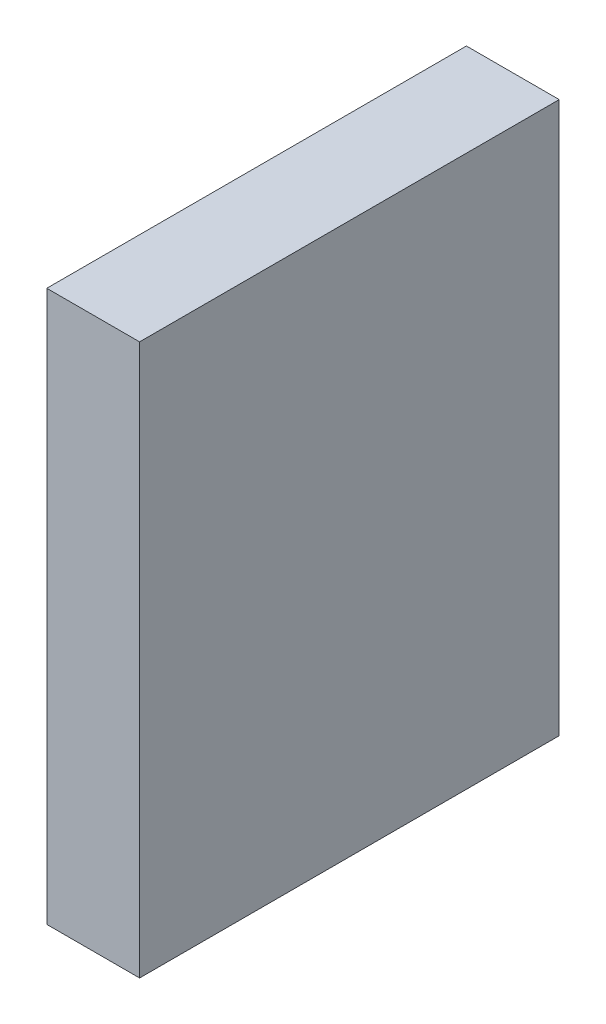
ISO-10303-21;
HEADER;
FILE_DESCRIPTION(('STEP AP214'),'2;1');
FILE_NAME('part.step','',(''),(''),'','','');
FILE_SCHEMA(('AUTOMOTIVE_DESIGN { 1 0 10303 214 1 1 1 1 }'));
ENDSEC;
DATA;
#1=APPLICATION_CONTEXT('core data for automotive mechanical design processes');
#2=APPLICATION_PROTOCOL_DEFINITION('international standard','automotive_design',2000,#1);
#3=PRODUCT_CONTEXT('',#1,'mechanical');
#4=PRODUCT('Part','Part','',(#3));
#5=PRODUCT_RELATED_PRODUCT_CATEGORY('part','',(#4));
#6=PRODUCT_DEFINITION_FORMATION('','',#4);
#7=PRODUCT_DEFINITION_CONTEXT('part definition',#1,'design');
#8=PRODUCT_DEFINITION('design','',#6,#7);
#9=PRODUCT_DEFINITION_SHAPE('','',#8);
#10=(LENGTH_UNIT() NAMED_UNIT(*) SI_UNIT(.MILLI.,.METRE.));
#11=(NAMED_UNIT(*) PLANE_ANGLE_UNIT() SI_UNIT($,.RADIAN.));
#12=(NAMED_UNIT(*) SI_UNIT($,.STERADIAN.) SOLID_ANGLE_UNIT());
#13=UNCERTAINTY_MEASURE_WITH_UNIT(LENGTH_MEASURE(1.E-05),#10,'distance_accuracy_value','');
#14=(GEOMETRIC_REPRESENTATION_CONTEXT(3) GLOBAL_UNCERTAINTY_ASSIGNED_CONTEXT((#13)) GLOBAL_UNIT_ASSIGNED_CONTEXT((#10,
#11,#12)) REPRESENTATION_CONTEXT('',''));
#15=CARTESIAN_POINT('',(0.,0.,0.));
#16=DIRECTION('',(0.,0.,1.));
#17=DIRECTION('',(1.,0.,0.));
#18=AXIS2_PLACEMENT_3D('',#15,#16,#17);
#19=CARTESIAN_POINT('',(5.584960357602,1.5228465416346,0.));
#20=DIRECTION('',(1.,0.,0.));
#21=DIRECTION('',(0.,1.,0.));
#22=AXIS2_PLACEMENT_3D('',#19,#20,#21);
#23=PLANE('',#22);
#24=DIRECTION('',(0.,-1.,0.));
#25=VECTOR('',#24,1.);
#26=CARTESIAN_POINT('',(5.584960357602,1.6541374403639,0.));
#27=LINE('',#26,#25);
#28=CARTESIAN_POINT('',(5.584960357602,1.6541374403639,0.));
#29=VERTEX_POINT('',#28);
#30=CARTESIAN_POINT('',(5.584960357602,1.5228465416346,0.));
#31=VERTEX_POINT('',#30);
#32=EDGE_CURVE('E11',#29,#31,#27,.T.);
#33=ORIENTED_EDGE('',*,*,#32,.F.);
#34=DIRECTION('',(0.,0.,1.));
#35=VECTOR('',#34,1.);
#36=CARTESIAN_POINT('',(5.584960357602,1.6541374403639,0.));
#37=LINE('',#36,#35);
#38=CARTESIAN_POINT('',(5.584960357602,1.6541374403639,0.1));
#39=VERTEX_POINT('',#38);
#40=EDGE_CURVE('E24',#29,#39,#37,.T.);
#41=ORIENTED_EDGE('',*,*,#40,.T.);
#42=DIRECTION('',(0.,1.,0.));
#43=VECTOR('',#42,1.);
#44=CARTESIAN_POINT('',(5.584960357602,1.6541374403639,0.1));
#45=LINE('',#44,#43);
#46=CARTESIAN_POINT('',(5.584960357602,1.5228465416346,0.1));
#47=VERTEX_POINT('',#46);
#48=EDGE_CURVE('E75',#47,#39,#45,.T.);
#49=ORIENTED_EDGE('',*,*,#48,.F.);
#50=DIRECTION('',(0.,0.,1.));
#51=VECTOR('',#50,1.);
#52=CARTESIAN_POINT('',(5.584960357602,1.5228465416346,0.));
#53=LINE('',#52,#51);
#54=EDGE_CURVE('E85',#31,#47,#53,.T.);
#55=ORIENTED_EDGE('',*,*,#54,.F.);
#56=EDGE_LOOP('',(#33,#41,#49,#55));
#57=FACE_BOUND('',#56,.T.);
#58=ADVANCED_FACE('F17',(#57),#23,.T.);
#59=CARTESIAN_POINT('',(5.5628422364338,1.5228465416346,0.));
#60=DIRECTION('',(0.,-1.,0.));
#61=DIRECTION('',(1.,0.,0.));
#62=AXIS2_PLACEMENT_3D('',#59,#60,#61);
#63=PLANE('',#62);
#64=DIRECTION('',(-1.,0.,0.));
#65=VECTOR('',#64,1.);
#66=CARTESIAN_POINT('',(5.584960357602,1.5228465416346,0.));
#67=LINE('',#66,#65);
#68=CARTESIAN_POINT('',(5.5628422364338,1.5228465416346,0.));
#69=VERTEX_POINT('',#68);
#70=EDGE_CURVE('E83',#31,#69,#67,.T.);
#71=ORIENTED_EDGE('',*,*,#70,.F.);
#72=ORIENTED_EDGE('',*,*,#54,.T.);
#73=DIRECTION('',(1.,0.,0.));
#74=VECTOR('',#73,1.);
#75=CARTESIAN_POINT('',(5.584960357602,1.5228465416346,0.1));
#76=LINE('',#75,#74);
#77=CARTESIAN_POINT('',(5.5628422364338,1.5228465416346,0.1));
#78=VERTEX_POINT('',#77);
#79=EDGE_CURVE('E81',#78,#47,#76,.T.);
#80=ORIENTED_EDGE('',*,*,#79,.F.);
#81=DIRECTION('',(0.,0.,1.));
#82=VECTOR('',#81,1.);
#83=CARTESIAN_POINT('',(5.5628422364338,1.5228465416346,0.));
#84=LINE('',#83,#82);
#85=EDGE_CURVE('E61',#69,#78,#84,.T.);
#86=ORIENTED_EDGE('',*,*,#85,.F.);
#87=EDGE_LOOP('',(#71,#72,#80,#86));
#88=FACE_BOUND('',#87,.T.);
#89=ADVANCED_FACE('F91',(#88),#63,.T.);
#90=CARTESIAN_POINT('',(5.5628422364338,1.6541374403639,0.));
#91=DIRECTION('',(-1.,0.,0.));
#92=DIRECTION('',(0.,-1.,0.));
#93=AXIS2_PLACEMENT_3D('',#90,#91,#92);
#94=PLANE('',#93);
#95=DIRECTION('',(0.,1.,0.));
#96=VECTOR('',#95,1.);
#97=CARTESIAN_POINT('',(5.5628422364338,1.5228465416346,0.));
#98=LINE('',#97,#96);
#99=CARTESIAN_POINT('',(5.5628422364338,1.6541374403639,0.));
#100=VERTEX_POINT('',#99);
#101=EDGE_CURVE('E65',#69,#100,#98,.T.);
#102=ORIENTED_EDGE('',*,*,#101,.F.);
#103=ORIENTED_EDGE('',*,*,#85,.T.);
#104=DIRECTION('',(0.,-1.,0.));
#105=VECTOR('',#104,1.);
#106=CARTESIAN_POINT('',(5.5628422364338,1.5228465416346,0.1));
#107=LINE('',#106,#105);
#108=CARTESIAN_POINT('',(5.5628422364338,1.6541374403639,0.1));
#109=VERTEX_POINT('',#108);
#110=EDGE_CURVE('E54',#109,#78,#107,.T.);
#111=ORIENTED_EDGE('',*,*,#110,.F.);
#112=DIRECTION('',(0.,0.,1.));
#113=VECTOR('',#112,1.);
#114=CARTESIAN_POINT('',(5.5628422364338,1.6541374403639,0.));
#115=LINE('',#114,#113);
#116=EDGE_CURVE('E58',#100,#109,#115,.T.);
#117=ORIENTED_EDGE('',*,*,#116,.F.);
#118=EDGE_LOOP('',(#102,#103,#111,#117));
#119=FACE_BOUND('',#118,.T.);
#120=ADVANCED_FACE('F57',(#119),#94,.T.);
#121=CARTESIAN_POINT('',(5.584960357602,1.6541374403639,0.));
#122=DIRECTION('',(0.,1.,0.));
#123=DIRECTION('',(-1.,0.,0.));
#124=AXIS2_PLACEMENT_3D('',#121,#122,#123);
#125=PLANE('',#124);
#126=DIRECTION('',(1.,0.,0.));
#127=VECTOR('',#126,1.);
#128=CARTESIAN_POINT('',(5.5628422364338,1.6541374403639,0.));
#129=LINE('',#128,#127);
#130=EDGE_CURVE('E71',#100,#29,#129,.T.);
#131=ORIENTED_EDGE('',*,*,#130,.F.);
#132=ORIENTED_EDGE('',*,*,#116,.T.);
#133=DIRECTION('',(-1.,0.,0.));
#134=VECTOR('',#133,1.);
#135=CARTESIAN_POINT('',(5.5628422364338,1.6541374403639,0.1));
#136=LINE('',#135,#134);
#137=EDGE_CURVE('E70',#39,#109,#136,.T.);
#138=ORIENTED_EDGE('',*,*,#137,.F.);
#139=ORIENTED_EDGE('',*,*,#40,.F.);
#140=EDGE_LOOP('',(#131,#132,#138,#139));
#141=FACE_BOUND('',#140,.T.);
#142=ADVANCED_FACE('F69',(#141),#125,.T.);
#143=CARTESIAN_POINT('',(5.5739012970179,1.5884919909993,0.));
#144=DIRECTION('',(0.,0.,1.));
#145=DIRECTION('',(1.,0.,0.));
#146=AXIS2_PLACEMENT_3D('',#143,#144,#145);
#147=PLANE('',#146);
#148=ORIENTED_EDGE('',*,*,#130,.T.);
#149=ORIENTED_EDGE('',*,*,#32,.T.);
#150=ORIENTED_EDGE('',*,*,#70,.T.);
#151=ORIENTED_EDGE('',*,*,#101,.T.);
#152=EDGE_LOOP('',(#148,#149,#150,#151));
#153=FACE_BOUND('',#152,.T.);
#154=ADVANCED_FACE('F88',(#153),#147,.F.);
#155=CARTESIAN_POINT('',(5.5739012970179,1.5884919909993,0.1));
#156=DIRECTION('',(0.,0.,1.));
#157=DIRECTION('',(1.,0.,0.));
#158=AXIS2_PLACEMENT_3D('',#155,#156,#157);
#159=PLANE('',#158);
#160=ORIENTED_EDGE('',*,*,#137,.T.);
#161=ORIENTED_EDGE('',*,*,#110,.T.);
#162=ORIENTED_EDGE('',*,*,#79,.T.);
#163=ORIENTED_EDGE('',*,*,#48,.T.);
#164=EDGE_LOOP('',(#160,#161,#162,#163));
#165=FACE_BOUND('',#164,.T.);
#166=ADVANCED_FACE('F74',(#165),#159,.T.);
#167=CLOSED_SHELL('',(#58,#89,#120,#142,#154,#166));
#168=MANIFOLD_SOLID_BREP('B1',#167);
#169=ADVANCED_BREP_SHAPE_REPRESENTATION('',(#18,#168),#14);
#170=SHAPE_DEFINITION_REPRESENTATION(#9,#169);
ENDSEC;
END-ISO-10303-21;
